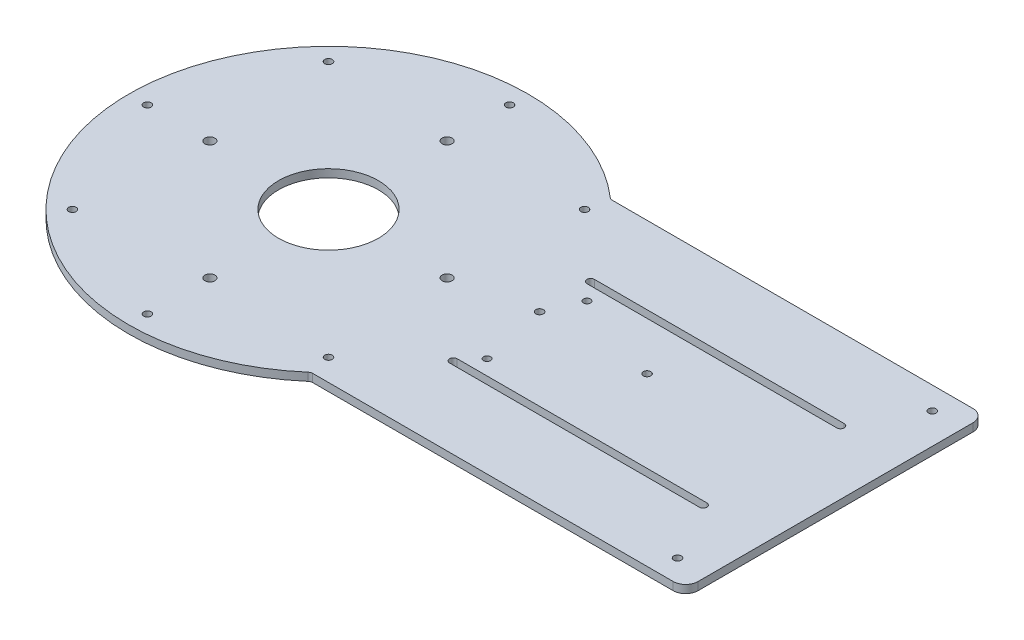
ISO-10303-21;
HEADER;
FILE_DESCRIPTION(('STEP AP214'),'2;1');
FILE_NAME('part.step','',(''),(''),'','','');
FILE_SCHEMA(('AUTOMOTIVE_DESIGN { 1 0 10303 214 1 1 1 1 }'));
ENDSEC;
DATA;
#1=APPLICATION_CONTEXT('core data for automotive mechanical design processes');
#2=APPLICATION_PROTOCOL_DEFINITION('international standard','automotive_design',2000,#1);
#3=PRODUCT_CONTEXT('',#1,'mechanical');
#4=PRODUCT('Part','Part','',(#3));
#5=PRODUCT_RELATED_PRODUCT_CATEGORY('part','',(#4));
#6=PRODUCT_DEFINITION_FORMATION('','',#4);
#7=PRODUCT_DEFINITION_CONTEXT('part definition',#1,'design');
#8=PRODUCT_DEFINITION('design','',#6,#7);
#9=PRODUCT_DEFINITION_SHAPE('','',#8);
#10=(LENGTH_UNIT() NAMED_UNIT(*) SI_UNIT(.MILLI.,.METRE.));
#11=(NAMED_UNIT(*) PLANE_ANGLE_UNIT() SI_UNIT($,.RADIAN.));
#12=(NAMED_UNIT(*) SI_UNIT($,.STERADIAN.) SOLID_ANGLE_UNIT());
#13=UNCERTAINTY_MEASURE_WITH_UNIT(LENGTH_MEASURE(1.E-05),#10,'distance_accuracy_value','');
#14=(GEOMETRIC_REPRESENTATION_CONTEXT(3) GLOBAL_UNCERTAINTY_ASSIGNED_CONTEXT((#13)) GLOBAL_UNIT_ASSIGNED_CONTEXT((#10,
#11,#12)) REPRESENTATION_CONTEXT('',''));
#15=CARTESIAN_POINT('',(0.,0.,0.));
#16=DIRECTION('',(0.,0.,1.));
#17=DIRECTION('',(1.,0.,0.));
#18=AXIS2_PLACEMENT_3D('',#15,#16,#17);
#19=CARTESIAN_POINT('',(157.5,3.2,-27.5));
#20=DIRECTION('',(0.,-1.,0.));
#21=DIRECTION('',(0.,0.,-1.));
#22=AXIS2_PLACEMENT_3D('',#19,#20,#21);
#23=CYLINDRICAL_SURFACE('',#22,1.5);
#24=CARTESIAN_POINT('',(157.5,0.,-27.5));
#25=DIRECTION('',(0.,1.,0.));
#26=DIRECTION('',(0.,0.,1.));
#27=AXIS2_PLACEMENT_3D('',#24,#25,#26);
#28=CIRCLE('',#27,1.5);
#29=CARTESIAN_POINT('',(157.5,0.,-29.));
#30=VERTEX_POINT('',#29);
#31=CARTESIAN_POINT('',(157.5,0.,-26.));
#32=VERTEX_POINT('',#31);
#33=EDGE_CURVE('E317',#30,#32,#28,.T.);
#34=ORIENTED_EDGE('',*,*,#33,.F.);
#35=DIRECTION('',(0.,-1.,0.));
#36=VECTOR('',#35,1.);
#37=CARTESIAN_POINT('',(157.5,3.2,-29.));
#38=LINE('',#37,#36);
#39=CARTESIAN_POINT('',(157.5,3.2,-29.));
#40=VERTEX_POINT('',#39);
#41=EDGE_CURVE('E11',#40,#30,#38,.T.);
#42=ORIENTED_EDGE('',*,*,#41,.F.);
#43=CARTESIAN_POINT('',(157.5,3.2,-27.5));
#44=DIRECTION('',(0.,1.,0.));
#45=DIRECTION('',(0.,0.,1.));
#46=AXIS2_PLACEMENT_3D('',#43,#44,#45);
#47=CIRCLE('',#46,1.5);
#48=CARTESIAN_POINT('',(157.5,3.2,-26.));
#49=VERTEX_POINT('',#48);
#50=EDGE_CURVE('E186',#40,#49,#47,.T.);
#51=ORIENTED_EDGE('',*,*,#50,.T.);
#52=DIRECTION('',(0.,-1.,0.));
#53=VECTOR('',#52,1.);
#54=CARTESIAN_POINT('',(157.5,3.2,-26.));
#55=LINE('',#54,#53);
#56=EDGE_CURVE('E125',#49,#32,#55,.T.);
#57=ORIENTED_EDGE('',*,*,#56,.T.);
#58=EDGE_LOOP('',(#34,#42,#51,#57));
#59=FACE_BOUND('',#58,.T.);
#60=ADVANCED_FACE('F47',(#59),#23,.F.);
#61=CARTESIAN_POINT('',(0.,3.2,-28.9999999999999));
#62=DIRECTION('',(0.,0.,1.));
#63=DIRECTION('',(1.,0.,0.));
#64=AXIS2_PLACEMENT_3D('',#61,#62,#63);
#65=PLANE('',#64);
#66=DIRECTION('',(-1.,0.,0.));
#67=VECTOR('',#66,1.);
#68=CARTESIAN_POINT('',(0.,0.,-28.9999999999999));
#69=LINE('',#68,#67);
#70=CARTESIAN_POINT('',(257.5,0.,-29.));
#71=VERTEX_POINT('',#70);
#72=EDGE_CURVE('E176',#71,#30,#69,.T.);
#73=ORIENTED_EDGE('',*,*,#72,.F.);
#74=DIRECTION('',(0.,-1.,0.));
#75=VECTOR('',#74,1.);
#76=CARTESIAN_POINT('',(257.5,3.2,-29.));
#77=LINE('',#76,#75);
#78=CARTESIAN_POINT('',(257.5,3.2,-29.));
#79=VERTEX_POINT('',#78);
#80=EDGE_CURVE('E58',#79,#71,#77,.T.);
#81=ORIENTED_EDGE('',*,*,#80,.F.);
#82=DIRECTION('',(-1.,0.,0.));
#83=VECTOR('',#82,1.);
#84=CARTESIAN_POINT('',(0.,3.2,-28.9999999999999));
#85=LINE('',#84,#83);
#86=EDGE_CURVE('E174',#79,#40,#85,.T.);
#87=ORIENTED_EDGE('',*,*,#86,.T.);
#88=ORIENTED_EDGE('',*,*,#41,.T.);
#89=EDGE_LOOP('',(#73,#81,#87,#88));
#90=FACE_BOUND('',#89,.T.);
#91=ADVANCED_FACE('F173',(#90),#65,.T.);
#92=CARTESIAN_POINT('',(257.5,3.2,-27.5));
#93=DIRECTION('',(0.,-1.,0.));
#94=DIRECTION('',(0.,0.,-1.));
#95=AXIS2_PLACEMENT_3D('',#92,#93,#94);
#96=CYLINDRICAL_SURFACE('',#95,1.50000000000003);
#97=CARTESIAN_POINT('',(257.5,0.,-27.5));
#98=DIRECTION('',(0.,1.,0.));
#99=DIRECTION('',(0.,0.,1.));
#100=AXIS2_PLACEMENT_3D('',#97,#98,#99);
#101=CIRCLE('',#100,1.50000000000003);
#102=CARTESIAN_POINT('',(257.5,0.,-26.));
#103=VERTEX_POINT('',#102);
#104=EDGE_CURVE('E323',#103,#71,#101,.T.);
#105=ORIENTED_EDGE('',*,*,#104,.F.);
#106=DIRECTION('',(0.,-1.,0.));
#107=VECTOR('',#106,1.);
#108=CARTESIAN_POINT('',(257.5,3.2,-26.));
#109=LINE('',#108,#107);
#110=CARTESIAN_POINT('',(257.5,3.2,-26.));
#111=VERTEX_POINT('',#110);
#112=EDGE_CURVE('E118',#111,#103,#109,.T.);
#113=ORIENTED_EDGE('',*,*,#112,.F.);
#114=CARTESIAN_POINT('',(257.5,3.2,-27.5));
#115=DIRECTION('',(0.,1.,0.));
#116=DIRECTION('',(0.,0.,1.));
#117=AXIS2_PLACEMENT_3D('',#114,#115,#116);
#118=CIRCLE('',#117,1.50000000000003);
#119=EDGE_CURVE('E185',#111,#79,#118,.T.);
#120=ORIENTED_EDGE('',*,*,#119,.T.);
#121=ORIENTED_EDGE('',*,*,#80,.T.);
#122=EDGE_LOOP('',(#105,#113,#120,#121));
#123=FACE_BOUND('',#122,.T.);
#124=ADVANCED_FACE('F189',(#123),#96,.F.);
#125=CARTESIAN_POINT('',(157.5,3.2,27.5));
#126=DIRECTION('',(0.,-1.,0.));
#127=DIRECTION('',(0.,0.,-1.));
#128=AXIS2_PLACEMENT_3D('',#125,#126,#127);
#129=CYLINDRICAL_SURFACE('',#128,1.5);
#130=CARTESIAN_POINT('',(157.5,0.,27.5));
#131=DIRECTION('',(0.,1.,0.));
#132=DIRECTION('',(0.,0.,1.));
#133=AXIS2_PLACEMENT_3D('',#130,#131,#132);
#134=CIRCLE('',#133,1.5);
#135=CARTESIAN_POINT('',(157.5,0.,26.));
#136=VERTEX_POINT('',#135);
#137=CARTESIAN_POINT('',(157.5,0.,29.));
#138=VERTEX_POINT('',#137);
#139=EDGE_CURVE('E301',#136,#138,#134,.T.);
#140=ORIENTED_EDGE('',*,*,#139,.F.);
#141=DIRECTION('',(0.,-1.,0.));
#142=VECTOR('',#141,1.);
#143=CARTESIAN_POINT('',(157.5,3.2,26.));
#144=LINE('',#143,#142);
#145=CARTESIAN_POINT('',(157.5,3.2,26.));
#146=VERTEX_POINT('',#145);
#147=EDGE_CURVE('E340',#146,#136,#144,.T.);
#148=ORIENTED_EDGE('',*,*,#147,.F.);
#149=CARTESIAN_POINT('',(157.5,3.2,27.5));
#150=DIRECTION('',(0.,1.,0.));
#151=DIRECTION('',(0.,0.,1.));
#152=AXIS2_PLACEMENT_3D('',#149,#150,#151);
#153=CIRCLE('',#152,1.5);
#154=CARTESIAN_POINT('',(157.5,3.2,29.));
#155=VERTEX_POINT('',#154);
#156=EDGE_CURVE('E822',#146,#155,#153,.T.);
#157=ORIENTED_EDGE('',*,*,#156,.T.);
#158=DIRECTION('',(0.,-1.,0.));
#159=VECTOR('',#158,1.);
#160=CARTESIAN_POINT('',(157.5,3.2,29.));
#161=LINE('',#160,#159);
#162=EDGE_CURVE('E343',#155,#138,#161,.T.);
#163=ORIENTED_EDGE('',*,*,#162,.T.);
#164=EDGE_LOOP('',(#140,#148,#157,#163));
#165=FACE_BOUND('',#164,.T.);
#166=ADVANCED_FACE('F447',(#165),#129,.F.);
#167=CARTESIAN_POINT('',(0.,3.2,26.0000000000001));
#168=DIRECTION('',(0.,0.,-1.));
#169=DIRECTION('',(-1.,0.,0.));
#170=AXIS2_PLACEMENT_3D('',#167,#168,#169);
#171=PLANE('',#170);
#172=DIRECTION('',(1.,0.,0.));
#173=VECTOR('',#172,1.);
#174=CARTESIAN_POINT('',(0.,0.,26.0000000000001));
#175=LINE('',#174,#173);
#176=CARTESIAN_POINT('',(257.5,0.,26.));
#177=VERTEX_POINT('',#176);
#178=EDGE_CURVE('E305',#136,#177,#175,.T.);
#179=ORIENTED_EDGE('',*,*,#178,.T.);
#180=DIRECTION('',(0.,-1.,0.));
#181=VECTOR('',#180,1.);
#182=CARTESIAN_POINT('',(257.5,3.2,26.));
#183=LINE('',#182,#181);
#184=CARTESIAN_POINT('',(257.5,3.2,26.));
#185=VERTEX_POINT('',#184);
#186=EDGE_CURVE('E349',#185,#177,#183,.T.);
#187=ORIENTED_EDGE('',*,*,#186,.F.);
#188=DIRECTION('',(1.,0.,0.));
#189=VECTOR('',#188,1.);
#190=CARTESIAN_POINT('',(0.,3.2,26.0000000000001));
#191=LINE('',#190,#189);
#192=EDGE_CURVE('E825',#146,#185,#191,.T.);
#193=ORIENTED_EDGE('',*,*,#192,.F.);
#194=ORIENTED_EDGE('',*,*,#147,.T.);
#195=EDGE_LOOP('',(#179,#187,#193,#194));
#196=FACE_BOUND('',#195,.T.);
#197=ADVANCED_FACE('F443',(#196),#171,.F.);
#198=CARTESIAN_POINT('',(257.5,3.2,27.5));
#199=DIRECTION('',(0.,-1.,0.));
#200=DIRECTION('',(0.,0.,-1.));
#201=AXIS2_PLACEMENT_3D('',#198,#199,#200);
#202=CYLINDRICAL_SURFACE('',#201,1.50000000000003);
#203=CARTESIAN_POINT('',(257.5,0.,27.5));
#204=DIRECTION('',(0.,1.,0.));
#205=DIRECTION('',(0.,0.,1.));
#206=AXIS2_PLACEMENT_3D('',#203,#204,#205);
#207=CIRCLE('',#206,1.50000000000003);
#208=CARTESIAN_POINT('',(257.5,0.,29.));
#209=VERTEX_POINT('',#208);
#210=EDGE_CURVE('E309',#209,#177,#207,.T.);
#211=ORIENTED_EDGE('',*,*,#210,.F.);
#212=DIRECTION('',(0.,-1.,0.));
#213=VECTOR('',#212,1.);
#214=CARTESIAN_POINT('',(257.5,3.2,29.));
#215=LINE('',#214,#213);
#216=CARTESIAN_POINT('',(257.5,3.2,29.));
#217=VERTEX_POINT('',#216);
#218=EDGE_CURVE('E346',#217,#209,#215,.T.);
#219=ORIENTED_EDGE('',*,*,#218,.F.);
#220=CARTESIAN_POINT('',(257.5,3.2,27.5));
#221=DIRECTION('',(0.,1.,0.));
#222=DIRECTION('',(0.,0.,1.));
#223=AXIS2_PLACEMENT_3D('',#220,#221,#222);
#224=CIRCLE('',#223,1.50000000000003);
#225=EDGE_CURVE('E833',#217,#185,#224,.T.);
#226=ORIENTED_EDGE('',*,*,#225,.T.);
#227=ORIENTED_EDGE('',*,*,#186,.T.);
#228=EDGE_LOOP('',(#211,#219,#226,#227));
#229=FACE_BOUND('',#228,.T.);
#230=ADVANCED_FACE('F440',(#229),#202,.F.);
#231=CARTESIAN_POINT('',(283.,3.2,0.));
#232=DIRECTION('',(1.,0.,0.));
#233=DIRECTION('',(0.,0.,-1.));
#234=AXIS2_PLACEMENT_3D('',#231,#232,#233);
#235=PLANE('',#234);
#236=DIRECTION('',(0.,0.,1.));
#237=VECTOR('',#236,1.);
#238=CARTESIAN_POINT('',(283.,0.,0.));
#239=LINE('',#238,#237);
#240=CARTESIAN_POINT('',(283.,0.,-55.));
#241=VERTEX_POINT('',#240);
#242=CARTESIAN_POINT('',(283.,0.,55.));
#243=VERTEX_POINT('',#242);
#244=EDGE_CURVE('E213',#241,#243,#239,.T.);
#245=ORIENTED_EDGE('',*,*,#244,.F.);
#246=DIRECTION('',(0.,-1.,0.));
#247=VECTOR('',#246,1.);
#248=CARTESIAN_POINT('',(283.,3.2,-55.));
#249=LINE('',#248,#247);
#250=CARTESIAN_POINT('',(283.,3.2,-55.));
#251=VERTEX_POINT('',#250);
#252=EDGE_CURVE('E51',#251,#241,#249,.T.);
#253=ORIENTED_EDGE('',*,*,#252,.F.);
#254=DIRECTION('',(0.,0.,1.));
#255=VECTOR('',#254,1.);
#256=CARTESIAN_POINT('',(283.,3.2,0.));
#257=LINE('',#256,#255);
#258=CARTESIAN_POINT('',(283.,3.2,55.));
#259=VERTEX_POINT('',#258);
#260=EDGE_CURVE('E389',#251,#259,#257,.T.);
#261=ORIENTED_EDGE('',*,*,#260,.T.);
#262=DIRECTION('',(0.,-1.,0.));
#263=VECTOR('',#262,1.);
#264=CARTESIAN_POINT('',(283.,3.2,55.));
#265=LINE('',#264,#263);
#266=EDGE_CURVE('E204',#259,#243,#265,.T.);
#267=ORIENTED_EDGE('',*,*,#266,.T.);
#268=EDGE_LOOP('',(#245,#253,#261,#267));
#269=FACE_BOUND('',#268,.T.);
#270=ADVANCED_FACE('F388',(#269),#235,.T.);
#271=CARTESIAN_POINT('',(278.,3.2,-55.));
#272=DIRECTION('',(0.,-1.,0.));
#273=DIRECTION('',(0.,0.,-1.));
#274=AXIS2_PLACEMENT_3D('',#271,#272,#273);
#275=CYLINDRICAL_SURFACE('',#274,5.);
#276=CARTESIAN_POINT('',(278.,0.,-55.));
#277=DIRECTION('',(0.,1.,0.));
#278=DIRECTION('',(0.,0.,1.));
#279=AXIS2_PLACEMENT_3D('',#276,#277,#278);
#280=CIRCLE('',#279,5.);
#281=CARTESIAN_POINT('',(278.,0.,-60.));
#282=VERTEX_POINT('',#281);
#283=EDGE_CURVE('E217',#241,#282,#280,.T.);
#284=ORIENTED_EDGE('',*,*,#283,.T.);
#285=DIRECTION('',(0.,-1.,0.));
#286=VECTOR('',#285,1.);
#287=CARTESIAN_POINT('',(278.,3.2,-60.));
#288=LINE('',#287,#286);
#289=CARTESIAN_POINT('',(278.,3.2,-60.));
#290=VERTEX_POINT('',#289);
#291=EDGE_CURVE('E372',#290,#282,#288,.T.);
#292=ORIENTED_EDGE('',*,*,#291,.F.);
#293=CARTESIAN_POINT('',(278.,3.2,-55.));
#294=DIRECTION('',(0.,1.,0.));
#295=DIRECTION('',(0.,0.,1.));
#296=AXIS2_PLACEMENT_3D('',#293,#294,#295);
#297=CIRCLE('',#296,5.);
#298=EDGE_CURVE('E382',#251,#290,#297,.T.);
#299=ORIENTED_EDGE('',*,*,#298,.F.);
#300=ORIENTED_EDGE('',*,*,#252,.T.);
#301=EDGE_LOOP('',(#284,#292,#299,#300));
#302=FACE_BOUND('',#301,.T.);
#303=ADVANCED_FACE('F380',(#302),#275,.T.);
#304=CARTESIAN_POINT('',(0.,3.2,-60.));
#305=DIRECTION('',(0.,0.,1.));
#306=DIRECTION('',(1.,0.,0.));
#307=AXIS2_PLACEMENT_3D('',#304,#305,#306);
#308=PLANE('',#307);
#309=DIRECTION('',(-1.,0.,0.));
#310=VECTOR('',#309,1.);
#311=CARTESIAN_POINT('',(0.,0.,-60.));
#312=LINE('',#311,#310);
#313=CARTESIAN_POINT('',(133.665631459995,0.,-60.));
#314=VERTEX_POINT('',#313);
#315=EDGE_CURVE('E221',#282,#314,#312,.T.);
#316=ORIENTED_EDGE('',*,*,#315,.T.);
#317=DIRECTION('',(0.,-1.,0.));
#318=VECTOR('',#317,1.);
#319=CARTESIAN_POINT('',(133.665631459995,3.2,-60.));
#320=LINE('',#319,#318);
#321=CARTESIAN_POINT('',(133.665631459995,3.2,-60.));
#322=VERTEX_POINT('',#321);
#323=EDGE_CURVE('E369',#322,#314,#320,.T.);
#324=ORIENTED_EDGE('',*,*,#323,.F.);
#325=DIRECTION('',(-1.,0.,0.));
#326=VECTOR('',#325,1.);
#327=CARTESIAN_POINT('',(0.,3.2,-60.));
#328=LINE('',#327,#326);
#329=EDGE_CURVE('E892',#290,#322,#328,.T.);
#330=ORIENTED_EDGE('',*,*,#329,.F.);
#331=ORIENTED_EDGE('',*,*,#291,.T.);
#332=EDGE_LOOP('',(#316,#324,#330,#331));
#333=FACE_BOUND('',#332,.T.);
#334=ADVANCED_FACE('F417',(#333),#308,.F.);
#335=CARTESIAN_POINT('',(133.665631459995,3.2,-62.));
#336=DIRECTION('',(0.,-1.,0.));
#337=DIRECTION('',(0.,0.,-1.));
#338=AXIS2_PLACEMENT_3D('',#335,#336,#337);
#339=CYLINDRICAL_SURFACE('',#338,1.99999999999999);
#340=CARTESIAN_POINT('',(133.665631459995,0.,-62.));
#341=DIRECTION('',(0.,1.,0.));
#342=DIRECTION('',(0.,0.,1.));
#343=AXIS2_PLACEMENT_3D('',#340,#341,#342);
#344=CIRCLE('',#343,1.99999999999999);
#345=CARTESIAN_POINT('',(132.356713619507,0.,-60.4878048780488));
#346=VERTEX_POINT('',#345);
#347=EDGE_CURVE('E225',#314,#346,#344,.F.);
#348=ORIENTED_EDGE('',*,*,#347,.T.);
#349=DIRECTION('',(0.,-1.,0.));
#350=VECTOR('',#349,1.);
#351=CARTESIAN_POINT('',(132.356713619507,3.2,-60.4878048780488));
#352=LINE('',#351,#350);
#353=CARTESIAN_POINT('',(132.356713619507,3.2,-60.4878048780488));
#354=VERTEX_POINT('',#353);
#355=EDGE_CURVE('E365',#354,#346,#352,.T.);
#356=ORIENTED_EDGE('',*,*,#355,.F.);
#357=CARTESIAN_POINT('',(133.665631459995,3.2,-62.));
#358=DIRECTION('',(0.,1.,0.));
#359=DIRECTION('',(0.,0.,1.));
#360=AXIS2_PLACEMENT_3D('',#357,#358,#359);
#361=CIRCLE('',#360,1.99999999999999);
#362=EDGE_CURVE('E415',#322,#354,#361,.F.);
#363=ORIENTED_EDGE('',*,*,#362,.F.);
#364=ORIENTED_EDGE('',*,*,#323,.T.);
#365=EDGE_LOOP('',(#348,#356,#363,#364));
#366=FACE_BOUND('',#365,.T.);
#367=ADVANCED_FACE('F413',(#366),#339,.F.);
#368=CARTESIAN_POINT('',(80.,3.2,0.));
#369=DIRECTION('',(0.,-1.,0.));
#370=DIRECTION('',(0.,0.,-1.));
#371=AXIS2_PLACEMENT_3D('',#368,#369,#370);
#372=CYLINDRICAL_SURFACE('',#371,80.);
#373=CARTESIAN_POINT('',(80.,0.,0.));
#374=DIRECTION('',(0.,1.,0.));
#375=DIRECTION('',(0.,0.,1.));
#376=AXIS2_PLACEMENT_3D('',#373,#374,#375);
#377=CIRCLE('',#376,80.);
#378=CARTESIAN_POINT('',(132.356713619507,0.,60.4878048780488));
#379=VERTEX_POINT('',#378);
#380=EDGE_CURVE('E229',#346,#379,#377,.T.);
#381=ORIENTED_EDGE('',*,*,#380,.T.);
#382=DIRECTION('',(0.,-1.,0.));
#383=VECTOR('',#382,1.);
#384=CARTESIAN_POINT('',(132.356713619507,3.2,60.4878048780488));
#385=LINE('',#384,#383);
#386=CARTESIAN_POINT('',(132.356713619507,3.2,60.4878048780488));
#387=VERTEX_POINT('',#386);
#388=EDGE_CURVE('E362',#387,#379,#385,.T.);
#389=ORIENTED_EDGE('',*,*,#388,.F.);
#390=CARTESIAN_POINT('',(80.,3.2,0.));
#391=DIRECTION('',(0.,1.,0.));
#392=DIRECTION('',(0.,0.,1.));
#393=AXIS2_PLACEMENT_3D('',#390,#391,#392);
#394=CIRCLE('',#393,80.);
#395=EDGE_CURVE('E887',#354,#387,#394,.T.);
#396=ORIENTED_EDGE('',*,*,#395,.F.);
#397=ORIENTED_EDGE('',*,*,#355,.T.);
#398=EDGE_LOOP('',(#381,#389,#396,#397));
#399=FACE_BOUND('',#398,.T.);
#400=ADVANCED_FACE('F409',(#399),#372,.T.);
#401=CARTESIAN_POINT('',(133.665631459995,3.2,62.));
#402=DIRECTION('',(0.,-1.,0.));
#403=DIRECTION('',(0.,0.,-1.));
#404=AXIS2_PLACEMENT_3D('',#401,#402,#403);
#405=CYLINDRICAL_SURFACE('',#404,2.);
#406=CARTESIAN_POINT('',(133.665631459995,0.,62.));
#407=DIRECTION('',(0.,1.,0.));
#408=DIRECTION('',(0.,0.,1.));
#409=AXIS2_PLACEMENT_3D('',#406,#407,#408);
#410=CIRCLE('',#409,2.);
#411=CARTESIAN_POINT('',(133.665631459995,0.,60.));
#412=VERTEX_POINT('',#411);
#413=EDGE_CURVE('E233',#412,#379,#410,.T.);
#414=ORIENTED_EDGE('',*,*,#413,.F.);
#415=DIRECTION('',(0.,-1.,0.));
#416=VECTOR('',#415,1.);
#417=CARTESIAN_POINT('',(133.665631459995,3.2,60.));
#418=LINE('',#417,#416);
#419=CARTESIAN_POINT('',(133.665631459995,3.2,60.));
#420=VERTEX_POINT('',#419);
#421=EDGE_CURVE('E359',#420,#412,#418,.T.);
#422=ORIENTED_EDGE('',*,*,#421,.F.);
#423=CARTESIAN_POINT('',(133.665631459995,3.2,62.));
#424=DIRECTION('',(0.,1.,0.));
#425=DIRECTION('',(0.,0.,1.));
#426=AXIS2_PLACEMENT_3D('',#423,#424,#425);
#427=CIRCLE('',#426,2.);
#428=EDGE_CURVE('E407',#420,#387,#427,.T.);
#429=ORIENTED_EDGE('',*,*,#428,.T.);
#430=ORIENTED_EDGE('',*,*,#388,.T.);
#431=EDGE_LOOP('',(#414,#422,#429,#430));
#432=FACE_BOUND('',#431,.T.);
#433=ADVANCED_FACE('F405',(#432),#405,.F.);
#434=CARTESIAN_POINT('',(0.,3.2,60.));
#435=DIRECTION('',(0.,0.,1.));
#436=DIRECTION('',(1.,0.,0.));
#437=AXIS2_PLACEMENT_3D('',#434,#435,#436);
#438=PLANE('',#437);
#439=DIRECTION('',(-1.,0.,0.));
#440=VECTOR('',#439,1.);
#441=CARTESIAN_POINT('',(0.,0.,60.));
#442=LINE('',#441,#440);
#443=CARTESIAN_POINT('',(278.,0.,60.));
#444=VERTEX_POINT('',#443);
#445=EDGE_CURVE('E237',#444,#412,#442,.T.);
#446=ORIENTED_EDGE('',*,*,#445,.F.);
#447=DIRECTION('',(0.,-1.,0.));
#448=VECTOR('',#447,1.);
#449=CARTESIAN_POINT('',(278.,3.2,60.));
#450=LINE('',#449,#448);
#451=CARTESIAN_POINT('',(278.,3.2,60.));
#452=VERTEX_POINT('',#451);
#453=EDGE_CURVE('E356',#452,#444,#450,.T.);
#454=ORIENTED_EDGE('',*,*,#453,.F.);
#455=DIRECTION('',(-1.,0.,0.));
#456=VECTOR('',#455,1.);
#457=CARTESIAN_POINT('',(0.,3.2,60.));
#458=LINE('',#457,#456);
#459=EDGE_CURVE('E401',#452,#420,#458,.T.);
#460=ORIENTED_EDGE('',*,*,#459,.T.);
#461=ORIENTED_EDGE('',*,*,#421,.T.);
#462=EDGE_LOOP('',(#446,#454,#460,#461));
#463=FACE_BOUND('',#462,.T.);
#464=ADVANCED_FACE('F398',(#463),#438,.T.);
#465=CARTESIAN_POINT('',(163.5,3.2,-20.));
#466=DIRECTION('',(0.,-1.,0.));
#467=DIRECTION('',(0.,0.,-1.));
#468=AXIS2_PLACEMENT_3D('',#465,#466,#467);
#469=CYLINDRICAL_SURFACE('',#468,1.4);
#470=CARTESIAN_POINT('',(163.5,3.2,-20.));
#471=DIRECTION('',(0.,1.,0.));
#472=DIRECTION('',(0.,0.,1.));
#473=AXIS2_PLACEMENT_3D('',#470,#471,#472);
#474=CIRCLE('',#473,1.4);
#475=CARTESIAN_POINT('',(163.5,3.2,-18.6));
#476=VERTEX_POINT('',#475);
#477=EDGE_CURVE('E193',#476,#476,#474,.T.);
#478=ORIENTED_EDGE('',*,*,#477,.T.);
#479=EDGE_LOOP('',(#478));
#480=FACE_BOUND('',#479,.T.);
#481=CARTESIAN_POINT('',(163.5,0.,-20.));
#482=DIRECTION('',(0.,1.,0.));
#483=DIRECTION('',(0.,0.,1.));
#484=AXIS2_PLACEMENT_3D('',#481,#482,#483);
#485=CIRCLE('',#484,1.4);
#486=CARTESIAN_POINT('',(163.5,0.,-18.6));
#487=VERTEX_POINT('',#486);
#488=EDGE_CURVE('E329',#487,#487,#485,.T.);
#489=ORIENTED_EDGE('',*,*,#488,.F.);
#490=EDGE_LOOP('',(#489));
#491=FACE_BOUND('',#490,.T.);
#492=ADVANCED_FACE('F512',(#480,#491),#469,.F.);
#493=CARTESIAN_POINT('',(0.,3.2,-26.));
#494=DIRECTION('',(0.,0.,1.));
#495=DIRECTION('',(1.,0.,0.));
#496=AXIS2_PLACEMENT_3D('',#493,#494,#495);
#497=PLANE('',#496);
#498=DIRECTION('',(-1.,0.,0.));
#499=VECTOR('',#498,1.);
#500=CARTESIAN_POINT('',(0.,0.,-26.));
#501=LINE('',#500,#499);
#502=EDGE_CURVE('E326',#103,#32,#501,.T.);
#503=ORIENTED_EDGE('',*,*,#502,.T.);
#504=ORIENTED_EDGE('',*,*,#56,.F.);
#505=DIRECTION('',(-1.,0.,0.));
#506=VECTOR('',#505,1.);
#507=CARTESIAN_POINT('',(0.,3.2,-26.));
#508=LINE('',#507,#506);
#509=EDGE_CURVE('E67',#111,#49,#508,.T.);
#510=ORIENTED_EDGE('',*,*,#509,.F.);
#511=ORIENTED_EDGE('',*,*,#112,.T.);
#512=EDGE_LOOP('',(#503,#504,#510,#511));
#513=FACE_BOUND('',#512,.T.);
#514=ADVANCED_FACE('F438',(#513),#497,.F.);
#515=CARTESIAN_POINT('',(0.,3.2,29.));
#516=DIRECTION('',(0.,0.,-1.));
#517=DIRECTION('',(-1.,0.,0.));
#518=AXIS2_PLACEMENT_3D('',#515,#516,#517);
#519=PLANE('',#518);
#520=DIRECTION('',(1.,0.,0.));
#521=VECTOR('',#520,1.);
#522=CARTESIAN_POINT('',(0.,0.,29.));
#523=LINE('',#522,#521);
#524=EDGE_CURVE('E313',#138,#209,#523,.T.);
#525=ORIENTED_EDGE('',*,*,#524,.F.);
#526=ORIENTED_EDGE('',*,*,#162,.F.);
#527=DIRECTION('',(1.,0.,0.));
#528=VECTOR('',#527,1.);
#529=CARTESIAN_POINT('',(0.,3.2,29.));
#530=LINE('',#529,#528);
#531=EDGE_CURVE('E828',#155,#217,#530,.T.);
#532=ORIENTED_EDGE('',*,*,#531,.T.);
#533=ORIENTED_EDGE('',*,*,#218,.T.);
#534=EDGE_LOOP('',(#525,#526,#532,#533));
#535=FACE_BOUND('',#534,.T.);
#536=ADVANCED_FACE('F434',(#535),#519,.T.);
#537=CARTESIAN_POINT('',(270.75,3.2,51.));
#538=DIRECTION('',(0.,-1.,0.));
#539=DIRECTION('',(0.,0.,-1.));
#540=AXIS2_PLACEMENT_3D('',#537,#538,#539);
#541=CYLINDRICAL_SURFACE('',#540,1.50000000000002);
#542=CARTESIAN_POINT('',(270.75,3.2,51.));
#543=DIRECTION('',(0.,1.,0.));
#544=DIRECTION('',(0.,0.,1.));
#545=AXIS2_PLACEMENT_3D('',#542,#543,#544);
#546=CIRCLE('',#545,1.50000000000002);
#547=CARTESIAN_POINT('',(270.75,3.2,52.5));
#548=VERTEX_POINT('',#547);
#549=EDGE_CURVE('E818',#548,#548,#546,.F.);
#550=ORIENTED_EDGE('',*,*,#549,.F.);
#551=EDGE_LOOP('',(#550));
#552=FACE_BOUND('',#551,.T.);
#553=CARTESIAN_POINT('',(270.75,0.,51.));
#554=DIRECTION('',(0.,1.,0.));
#555=DIRECTION('',(0.,0.,1.));
#556=AXIS2_PLACEMENT_3D('',#553,#554,#555);
#557=CIRCLE('',#556,1.50000000000002);
#558=CARTESIAN_POINT('',(270.75,0.,52.5));
#559=VERTEX_POINT('',#558);
#560=EDGE_CURVE('E297',#559,#559,#557,.F.);
#561=ORIENTED_EDGE('',*,*,#560,.T.);
#562=EDGE_LOOP('',(#561));
#563=FACE_BOUND('',#562,.T.);
#564=ADVANCED_FACE('F437',(#552,#563),#541,.F.);
#565=CARTESIAN_POINT('',(270.75,3.2,-51.));
#566=DIRECTION('',(0.,-1.,0.));
#567=DIRECTION('',(0.,0.,-1.));
#568=AXIS2_PLACEMENT_3D('',#565,#566,#567);
#569=CYLINDRICAL_SURFACE('',#568,1.50000000000002);
#570=CARTESIAN_POINT('',(270.75,3.2,-51.));
#571=DIRECTION('',(0.,1.,0.));
#572=DIRECTION('',(0.,0.,1.));
#573=AXIS2_PLACEMENT_3D('',#570,#571,#572);
#574=CIRCLE('',#573,1.50000000000002);
#575=CARTESIAN_POINT('',(270.75,3.2,-49.5));
#576=VERTEX_POINT('',#575);
#577=EDGE_CURVE('E814',#576,#576,#574,.T.);
#578=ORIENTED_EDGE('',*,*,#577,.T.);
#579=EDGE_LOOP('',(#578));
#580=FACE_BOUND('',#579,.T.);
#581=CARTESIAN_POINT('',(270.75,0.,-51.));
#582=DIRECTION('',(0.,1.,0.));
#583=DIRECTION('',(0.,0.,1.));
#584=AXIS2_PLACEMENT_3D('',#581,#582,#583);
#585=CIRCLE('',#584,1.50000000000002);
#586=CARTESIAN_POINT('',(270.75,0.,-49.5));
#587=VERTEX_POINT('',#586);
#588=EDGE_CURVE('E293',#587,#587,#585,.T.);
#589=ORIENTED_EDGE('',*,*,#588,.F.);
#590=EDGE_LOOP('',(#589));
#591=FACE_BOUND('',#590,.T.);
#592=ADVANCED_FACE('F454',(#580,#591),#569,.F.);
#593=CARTESIAN_POINT('',(79.9999999999995,3.2,47.5));
#594=DIRECTION('',(0.,-1.,0.));
#595=DIRECTION('',(0.,0.,-1.));
#596=AXIS2_PLACEMENT_3D('',#593,#594,#595);
#597=CYLINDRICAL_SURFACE('',#596,2.00000000000001);
#598=CARTESIAN_POINT('',(79.9999999999995,3.2,47.5));
#599=DIRECTION('',(0.,1.,0.));
#600=DIRECTION('',(0.,0.,1.));
#601=AXIS2_PLACEMENT_3D('',#598,#599,#600);
#602=CIRCLE('',#601,2.00000000000001);
#603=CARTESIAN_POINT('',(79.9999999999995,3.2,49.5));
#604=VERTEX_POINT('',#603);
#605=EDGE_CURVE('E810',#604,#604,#602,.T.);
#606=ORIENTED_EDGE('',*,*,#605,.T.);
#607=EDGE_LOOP('',(#606));
#608=FACE_BOUND('',#607,.T.);
#609=CARTESIAN_POINT('',(79.9999999999995,0.,47.5));
#610=DIRECTION('',(0.,1.,0.));
#611=DIRECTION('',(0.,0.,1.));
#612=AXIS2_PLACEMENT_3D('',#609,#610,#611);
#613=CIRCLE('',#612,2.00000000000001);
#614=CARTESIAN_POINT('',(79.9999999999995,0.,49.5));
#615=VERTEX_POINT('',#614);
#616=EDGE_CURVE('E289',#615,#615,#613,.T.);
#617=ORIENTED_EDGE('',*,*,#616,.F.);
#618=EDGE_LOOP('',(#617));
#619=FACE_BOUND('',#618,.T.);
#620=ADVANCED_FACE('F458',(#608,#619),#597,.F.);
#621=CARTESIAN_POINT('',(127.5,3.2,3.31690727190098E-13));
#622=DIRECTION('',(0.,-1.,0.));
#623=DIRECTION('',(0.,0.,-1.));
#624=AXIS2_PLACEMENT_3D('',#621,#622,#623);
#625=CYLINDRICAL_SURFACE('',#624,1.99999999999999);
#626=CARTESIAN_POINT('',(127.5,3.2,3.31690727190098E-13));
#627=DIRECTION('',(0.,1.,0.));
#628=DIRECTION('',(0.,0.,1.));
#629=AXIS2_PLACEMENT_3D('',#626,#627,#628);
#630=CIRCLE('',#629,1.99999999999999);
#631=CARTESIAN_POINT('',(127.5,3.2,2.00000000000032));
#632=VERTEX_POINT('',#631);
#633=EDGE_CURVE('E806',#632,#632,#630,.T.);
#634=ORIENTED_EDGE('',*,*,#633,.T.);
#635=EDGE_LOOP('',(#634));
#636=FACE_BOUND('',#635,.T.);
#637=CARTESIAN_POINT('',(127.5,0.,3.31690727190098E-13));
#638=DIRECTION('',(0.,1.,0.));
#639=DIRECTION('',(0.,0.,1.));
#640=AXIS2_PLACEMENT_3D('',#637,#638,#639);
#641=CIRCLE('',#640,1.99999999999999);
#642=CARTESIAN_POINT('',(127.5,0.,2.00000000000032));
#643=VERTEX_POINT('',#642);
#644=EDGE_CURVE('E285',#643,#643,#641,.T.);
#645=ORIENTED_EDGE('',*,*,#644,.F.);
#646=EDGE_LOOP('',(#645));
#647=FACE_BOUND('',#646,.T.);
#648=ADVANCED_FACE('F462',(#636,#647),#625,.F.);
#649=CARTESIAN_POINT('',(80.0000000000002,3.2,-47.5));
#650=DIRECTION('',(0.,-1.,0.));
#651=DIRECTION('',(0.,0.,-1.));
#652=AXIS2_PLACEMENT_3D('',#649,#650,#651);
#653=CYLINDRICAL_SURFACE('',#652,2.);
#654=CARTESIAN_POINT('',(80.0000000000002,3.2,-47.5));
#655=DIRECTION('',(0.,1.,0.));
#656=DIRECTION('',(0.,0.,1.));
#657=AXIS2_PLACEMENT_3D('',#654,#655,#656);
#658=CIRCLE('',#657,2.);
#659=CARTESIAN_POINT('',(80.0000000000002,3.2,-45.5));
#660=VERTEX_POINT('',#659);
#661=EDGE_CURVE('E802',#660,#660,#658,.T.);
#662=ORIENTED_EDGE('',*,*,#661,.T.);
#663=EDGE_LOOP('',(#662));
#664=FACE_BOUND('',#663,.T.);
#665=CARTESIAN_POINT('',(80.0000000000002,0.,-47.5));
#666=DIRECTION('',(0.,1.,0.));
#667=DIRECTION('',(0.,0.,1.));
#668=AXIS2_PLACEMENT_3D('',#665,#666,#667);
#669=CIRCLE('',#668,2.);
#670=CARTESIAN_POINT('',(80.0000000000002,0.,-45.5));
#671=VERTEX_POINT('',#670);
#672=EDGE_CURVE('E281',#671,#671,#669,.T.);
#673=ORIENTED_EDGE('',*,*,#672,.F.);
#674=EDGE_LOOP('',(#673));
#675=FACE_BOUND('',#674,.T.);
#676=ADVANCED_FACE('F466',(#664,#675),#653,.F.);
#677=CARTESIAN_POINT('',(32.5,3.2,0.));
#678=DIRECTION('',(0.,-1.,0.));
#679=DIRECTION('',(0.,0.,-1.));
#680=AXIS2_PLACEMENT_3D('',#677,#678,#679);
#681=CYLINDRICAL_SURFACE('',#680,2.);
#682=CARTESIAN_POINT('',(32.5,3.2,0.));
#683=DIRECTION('',(0.,1.,0.));
#684=DIRECTION('',(0.,0.,1.));
#685=AXIS2_PLACEMENT_3D('',#682,#683,#684);
#686=CIRCLE('',#685,2.);
#687=CARTESIAN_POINT('',(32.5,3.2,2.));
#688=VERTEX_POINT('',#687);
#689=EDGE_CURVE('E798',#688,#688,#686,.T.);
#690=ORIENTED_EDGE('',*,*,#689,.T.);
#691=EDGE_LOOP('',(#690));
#692=FACE_BOUND('',#691,.T.);
#693=CARTESIAN_POINT('',(32.5,0.,0.));
#694=DIRECTION('',(0.,1.,0.));
#695=DIRECTION('',(0.,0.,1.));
#696=AXIS2_PLACEMENT_3D('',#693,#694,#695);
#697=CIRCLE('',#696,2.);
#698=CARTESIAN_POINT('',(32.5,0.,2.));
#699=VERTEX_POINT('',#698);
#700=EDGE_CURVE('E277',#699,#699,#697,.T.);
#701=ORIENTED_EDGE('',*,*,#700,.F.);
#702=EDGE_LOOP('',(#701));
#703=FACE_BOUND('',#702,.T.);
#704=ADVANCED_FACE('F470',(#692,#703),#681,.F.);
#705=CARTESIAN_POINT('',(28.7347583639753,3.2,51.2652416360238));
#706=DIRECTION('',(0.,-1.,0.));
#707=DIRECTION('',(0.,0.,-1.));
#708=AXIS2_PLACEMENT_3D('',#705,#706,#707);
#709=CYLINDRICAL_SURFACE('',#708,1.5);
#710=CARTESIAN_POINT('',(28.7347583639753,3.2,51.2652416360238));
#711=DIRECTION('',(0.,1.,0.));
#712=DIRECTION('',(0.,0.,1.));
#713=AXIS2_PLACEMENT_3D('',#710,#711,#712);
#714=CIRCLE('',#713,1.5);
#715=CARTESIAN_POINT('',(28.7347583639753,3.2,52.7652416360238));
#716=VERTEX_POINT('',#715);
#717=EDGE_CURVE('E794',#716,#716,#714,.T.);
#718=ORIENTED_EDGE('',*,*,#717,.T.);
#719=EDGE_LOOP('',(#718));
#720=FACE_BOUND('',#719,.T.);
#721=CARTESIAN_POINT('',(28.7347583639753,0.,51.2652416360238));
#722=DIRECTION('',(0.,1.,0.));
#723=DIRECTION('',(0.,0.,1.));
#724=AXIS2_PLACEMENT_3D('',#721,#722,#723);
#725=CIRCLE('',#724,1.5);
#726=CARTESIAN_POINT('',(28.7347583639753,0.,52.7652416360238));
#727=VERTEX_POINT('',#726);
#728=EDGE_CURVE('E273',#727,#727,#725,.T.);
#729=ORIENTED_EDGE('',*,*,#728,.F.);
#730=EDGE_LOOP('',(#729));
#731=FACE_BOUND('',#730,.T.);
#732=ADVANCED_FACE('F474',(#720,#731),#709,.F.);
#733=CARTESIAN_POINT('',(80.0000000000002,3.2,72.499999999999));
#734=DIRECTION('',(0.,-1.,0.));
#735=DIRECTION('',(0.,0.,-1.));
#736=AXIS2_PLACEMENT_3D('',#733,#734,#735);
#737=CYLINDRICAL_SURFACE('',#736,1.50000000000001);
#738=CARTESIAN_POINT('',(80.0000000000002,3.2,72.499999999999));
#739=DIRECTION('',(0.,1.,0.));
#740=DIRECTION('',(0.,0.,1.));
#741=AXIS2_PLACEMENT_3D('',#738,#739,#740);
#742=CIRCLE('',#741,1.50000000000001);
#743=CARTESIAN_POINT('',(80.0000000000002,3.2,73.999999999999));
#744=VERTEX_POINT('',#743);
#745=EDGE_CURVE('E790',#744,#744,#742,.T.);
#746=ORIENTED_EDGE('',*,*,#745,.T.);
#747=EDGE_LOOP('',(#746));
#748=FACE_BOUND('',#747,.T.);
#749=CARTESIAN_POINT('',(80.0000000000002,0.,72.499999999999));
#750=DIRECTION('',(0.,1.,0.));
#751=DIRECTION('',(0.,0.,1.));
#752=AXIS2_PLACEMENT_3D('',#749,#750,#751);
#753=CIRCLE('',#752,1.50000000000001);
#754=CARTESIAN_POINT('',(80.0000000000002,0.,73.999999999999));
#755=VERTEX_POINT('',#754);
#756=EDGE_CURVE('E269',#755,#755,#753,.T.);
#757=ORIENTED_EDGE('',*,*,#756,.F.);
#758=EDGE_LOOP('',(#757));
#759=FACE_BOUND('',#758,.T.);
#760=ADVANCED_FACE('F478',(#748,#759),#737,.F.);
#761=CARTESIAN_POINT('',(131.265241636025,3.2,51.2652416360235));
#762=DIRECTION('',(0.,-1.,0.));
#763=DIRECTION('',(0.,0.,-1.));
#764=AXIS2_PLACEMENT_3D('',#761,#762,#763);
#765=CYLINDRICAL_SURFACE('',#764,1.49999999999999);
#766=CARTESIAN_POINT('',(131.265241636025,3.2,51.2652416360235));
#767=DIRECTION('',(0.,1.,0.));
#768=DIRECTION('',(0.,0.,1.));
#769=AXIS2_PLACEMENT_3D('',#766,#767,#768);
#770=CIRCLE('',#769,1.49999999999999);
#771=CARTESIAN_POINT('',(131.265241636025,3.2,52.7652416360235));
#772=VERTEX_POINT('',#771);
#773=EDGE_CURVE('E786',#772,#772,#770,.T.);
#774=ORIENTED_EDGE('',*,*,#773,.T.);
#775=EDGE_LOOP('',(#774));
#776=FACE_BOUND('',#775,.T.);
#777=CARTESIAN_POINT('',(131.265241636025,0.,51.2652416360235));
#778=DIRECTION('',(0.,1.,0.));
#779=DIRECTION('',(0.,0.,1.));
#780=AXIS2_PLACEMENT_3D('',#777,#778,#779);
#781=CIRCLE('',#780,1.49999999999999);
#782=CARTESIAN_POINT('',(131.265241636025,0.,52.7652416360235));
#783=VERTEX_POINT('',#782);
#784=EDGE_CURVE('E265',#783,#783,#781,.T.);
#785=ORIENTED_EDGE('',*,*,#784,.F.);
#786=EDGE_LOOP('',(#785));
#787=FACE_BOUND('',#786,.T.);
#788=ADVANCED_FACE('F482',(#776,#787),#765,.F.);
#789=CARTESIAN_POINT('',(131.265241636024,3.2,-51.2652416360261));
#790=DIRECTION('',(0.,-1.,0.));
#791=DIRECTION('',(0.,0.,-1.));
#792=AXIS2_PLACEMENT_3D('',#789,#790,#791);
#793=CYLINDRICAL_SURFACE('',#792,1.5);
#794=CARTESIAN_POINT('',(131.265241636024,3.2,-51.2652416360261));
#795=DIRECTION('',(0.,1.,0.));
#796=DIRECTION('',(0.,0.,1.));
#797=AXIS2_PLACEMENT_3D('',#794,#795,#796);
#798=CIRCLE('',#797,1.5);
#799=CARTESIAN_POINT('',(131.265241636024,3.2,-49.7652416360261));
#800=VERTEX_POINT('',#799);
#801=EDGE_CURVE('E782',#800,#800,#798,.T.);
#802=ORIENTED_EDGE('',*,*,#801,.T.);
#803=EDGE_LOOP('',(#802));
#804=FACE_BOUND('',#803,.T.);
#805=CARTESIAN_POINT('',(131.265241636024,0.,-51.2652416360261));
#806=DIRECTION('',(0.,1.,0.));
#807=DIRECTION('',(0.,0.,1.));
#808=AXIS2_PLACEMENT_3D('',#805,#806,#807);
#809=CIRCLE('',#808,1.5);
#810=CARTESIAN_POINT('',(131.265241636024,0.,-49.7652416360261));
#811=VERTEX_POINT('',#810);
#812=EDGE_CURVE('E261',#811,#811,#809,.T.);
#813=ORIENTED_EDGE('',*,*,#812,.F.);
#814=EDGE_LOOP('',(#813));
#815=FACE_BOUND('',#814,.T.);
#816=ADVANCED_FACE('F486',(#804,#815),#793,.F.);
#817=CARTESIAN_POINT('',(79.9999999999993,3.2,-72.500000000001));
#818=DIRECTION('',(0.,-1.,0.));
#819=DIRECTION('',(0.,0.,-1.));
#820=AXIS2_PLACEMENT_3D('',#817,#818,#819);
#821=CYLINDRICAL_SURFACE('',#820,1.5);
#822=CARTESIAN_POINT('',(79.9999999999993,3.2,-72.500000000001));
#823=DIRECTION('',(0.,1.,0.));
#824=DIRECTION('',(0.,0.,1.));
#825=AXIS2_PLACEMENT_3D('',#822,#823,#824);
#826=CIRCLE('',#825,1.5);
#827=CARTESIAN_POINT('',(79.9999999999993,3.2,-71.000000000001));
#828=VERTEX_POINT('',#827);
#829=EDGE_CURVE('E778',#828,#828,#826,.T.);
#830=ORIENTED_EDGE('',*,*,#829,.T.);
#831=EDGE_LOOP('',(#830));
#832=FACE_BOUND('',#831,.T.);
#833=CARTESIAN_POINT('',(79.9999999999993,0.,-72.500000000001));
#834=DIRECTION('',(0.,1.,0.));
#835=DIRECTION('',(0.,0.,1.));
#836=AXIS2_PLACEMENT_3D('',#833,#834,#835);
#837=CIRCLE('',#836,1.5);
#838=CARTESIAN_POINT('',(79.9999999999993,0.,-71.000000000001));
#839=VERTEX_POINT('',#838);
#840=EDGE_CURVE('E257',#839,#839,#837,.T.);
#841=ORIENTED_EDGE('',*,*,#840,.F.);
#842=EDGE_LOOP('',(#841));
#843=FACE_BOUND('',#842,.T.);
#844=ADVANCED_FACE('F490',(#832,#843),#821,.F.);
#845=CARTESIAN_POINT('',(28.7347583639747,3.2,-51.2652416360251));
#846=DIRECTION('',(0.,-1.,0.));
#847=DIRECTION('',(0.,0.,-1.));
#848=AXIS2_PLACEMENT_3D('',#845,#846,#847);
#849=CYLINDRICAL_SURFACE('',#848,1.5);
#850=CARTESIAN_POINT('',(28.7347583639747,3.2,-51.2652416360251));
#851=DIRECTION('',(0.,1.,0.));
#852=DIRECTION('',(0.,0.,1.));
#853=AXIS2_PLACEMENT_3D('',#850,#851,#852);
#854=CIRCLE('',#853,1.5);
#855=CARTESIAN_POINT('',(28.7347583639747,3.2,-49.7652416360251));
#856=VERTEX_POINT('',#855);
#857=EDGE_CURVE('E774',#856,#856,#854,.T.);
#858=ORIENTED_EDGE('',*,*,#857,.T.);
#859=EDGE_LOOP('',(#858));
#860=FACE_BOUND('',#859,.T.);
#861=CARTESIAN_POINT('',(28.7347583639747,0.,-51.2652416360251));
#862=DIRECTION('',(0.,1.,0.));
#863=DIRECTION('',(0.,0.,1.));
#864=AXIS2_PLACEMENT_3D('',#861,#862,#863);
#865=CIRCLE('',#864,1.5);
#866=CARTESIAN_POINT('',(28.7347583639747,0.,-49.7652416360251));
#867=VERTEX_POINT('',#866);
#868=EDGE_CURVE('E253',#867,#867,#865,.T.);
#869=ORIENTED_EDGE('',*,*,#868,.F.);
#870=EDGE_LOOP('',(#869));
#871=FACE_BOUND('',#870,.T.);
#872=ADVANCED_FACE('F494',(#860,#871),#849,.F.);
#873=CARTESIAN_POINT('',(7.49999999999997,3.2,0.));
#874=DIRECTION('',(0.,-1.,0.));
#875=DIRECTION('',(0.,0.,-1.));
#876=AXIS2_PLACEMENT_3D('',#873,#874,#875);
#877=CYLINDRICAL_SURFACE('',#876,1.5);
#878=CARTESIAN_POINT('',(7.49999999999997,3.2,0.));
#879=DIRECTION('',(0.,1.,0.));
#880=DIRECTION('',(0.,0.,1.));
#881=AXIS2_PLACEMENT_3D('',#878,#879,#880);
#882=CIRCLE('',#881,1.5);
#883=CARTESIAN_POINT('',(7.49999999999997,3.2,1.49999999999996));
#884=VERTEX_POINT('',#883);
#885=EDGE_CURVE('E770',#884,#884,#882,.T.);
#886=ORIENTED_EDGE('',*,*,#885,.T.);
#887=EDGE_LOOP('',(#886));
#888=FACE_BOUND('',#887,.T.);
#889=CARTESIAN_POINT('',(7.49999999999997,0.,0.));
#890=DIRECTION('',(0.,1.,0.));
#891=DIRECTION('',(0.,0.,1.));
#892=AXIS2_PLACEMENT_3D('',#889,#890,#891);
#893=CIRCLE('',#892,1.5);
#894=CARTESIAN_POINT('',(7.49999999999997,0.,1.49999999999996));
#895=VERTEX_POINT('',#894);
#896=EDGE_CURVE('E249',#895,#895,#893,.T.);
#897=ORIENTED_EDGE('',*,*,#896,.F.);
#898=EDGE_LOOP('',(#897));
#899=FACE_BOUND('',#898,.T.);
#900=ADVANCED_FACE('F498',(#888,#899),#877,.F.);
#901=CARTESIAN_POINT('',(80.,3.2,0.));
#902=DIRECTION('',(0.,-1.,0.));
#903=DIRECTION('',(0.,0.,-1.));
#904=AXIS2_PLACEMENT_3D('',#901,#902,#903);
#905=CYLINDRICAL_SURFACE('',#904,20.);
#906=CARTESIAN_POINT('',(80.,3.2,0.));
#907=DIRECTION('',(0.,1.,0.));
#908=DIRECTION('',(0.,0.,1.));
#909=AXIS2_PLACEMENT_3D('',#906,#907,#908);
#910=CIRCLE('',#909,20.);
#911=CARTESIAN_POINT('',(80.,3.2,20.));
#912=VERTEX_POINT('',#911);
#913=EDGE_CURVE('E766',#912,#912,#910,.T.);
#914=ORIENTED_EDGE('',*,*,#913,.T.);
#915=EDGE_LOOP('',(#914));
#916=FACE_BOUND('',#915,.T.);
#917=CARTESIAN_POINT('',(80.,0.,0.));
#918=DIRECTION('',(0.,1.,0.));
#919=DIRECTION('',(0.,0.,1.));
#920=AXIS2_PLACEMENT_3D('',#917,#918,#919);
#921=CIRCLE('',#920,20.);
#922=CARTESIAN_POINT('',(80.,0.,20.));
#923=VERTEX_POINT('',#922);
#924=EDGE_CURVE('E245',#923,#923,#921,.T.);
#925=ORIENTED_EDGE('',*,*,#924,.F.);
#926=EDGE_LOOP('',(#925));
#927=FACE_BOUND('',#926,.T.);
#928=ADVANCED_FACE('F502',(#916,#927),#905,.F.);
#929=CARTESIAN_POINT('',(278.,3.2,55.));
#930=DIRECTION('',(0.,-1.,0.));
#931=DIRECTION('',(0.,0.,-1.));
#932=AXIS2_PLACEMENT_3D('',#929,#930,#931);
#933=CYLINDRICAL_SURFACE('',#932,5.);
#934=CARTESIAN_POINT('',(278.,0.,55.));
#935=DIRECTION('',(0.,1.,0.));
#936=DIRECTION('',(0.,0.,1.));
#937=AXIS2_PLACEMENT_3D('',#934,#935,#936);
#938=CIRCLE('',#937,5.);
#939=EDGE_CURVE('E241',#243,#444,#938,.F.);
#940=ORIENTED_EDGE('',*,*,#939,.F.);
#941=ORIENTED_EDGE('',*,*,#266,.F.);
#942=CARTESIAN_POINT('',(278.,3.2,55.));
#943=DIRECTION('',(0.,1.,0.));
#944=DIRECTION('',(0.,0.,1.));
#945=AXIS2_PLACEMENT_3D('',#942,#943,#944);
#946=CIRCLE('',#945,5.);
#947=EDGE_CURVE('E394',#259,#452,#946,.F.);
#948=ORIENTED_EDGE('',*,*,#947,.T.);
#949=ORIENTED_EDGE('',*,*,#453,.T.);
#950=EDGE_LOOP('',(#940,#941,#948,#949));
#951=FACE_BOUND('',#950,.T.);
#952=ADVANCED_FACE('F393',(#951),#933,.T.);
#953=CARTESIAN_POINT('',(157.75,3.2,-6.79999999999998));
#954=DIRECTION('',(0.,-1.,0.));
#955=DIRECTION('',(0.,0.,-1.));
#956=AXIS2_PLACEMENT_3D('',#953,#954,#955);
#957=CYLINDRICAL_SURFACE('',#956,1.5);
#958=CARTESIAN_POINT('',(157.75,3.2,-6.79999999999998));
#959=DIRECTION('',(0.,1.,0.));
#960=DIRECTION('',(0.,0.,1.));
#961=AXIS2_PLACEMENT_3D('',#958,#959,#960);
#962=CIRCLE('',#961,1.5);
#963=CARTESIAN_POINT('',(157.75,3.2,-5.29999999999998));
#964=VERTEX_POINT('',#963);
#965=EDGE_CURVE('E761',#964,#964,#962,.T.);
#966=ORIENTED_EDGE('',*,*,#965,.T.);
#967=EDGE_LOOP('',(#966));
#968=FACE_BOUND('',#967,.T.);
#969=CARTESIAN_POINT('',(157.75,0.,-6.79999999999998));
#970=DIRECTION('',(0.,1.,0.));
#971=DIRECTION('',(0.,0.,1.));
#972=AXIS2_PLACEMENT_3D('',#969,#970,#971);
#973=CIRCLE('',#972,1.5);
#974=CARTESIAN_POINT('',(157.75,0.,-5.29999999999998));
#975=VERTEX_POINT('',#974);
#976=EDGE_CURVE('E209',#975,#975,#973,.T.);
#977=ORIENTED_EDGE('',*,*,#976,.F.);
#978=EDGE_LOOP('',(#977));
#979=FACE_BOUND('',#978,.T.);
#980=ADVANCED_FACE('F509',(#968,#979),#957,.F.);
#981=CARTESIAN_POINT('',(200.75,3.2,-6.79999999999998));
#982=DIRECTION('',(0.,-1.,0.));
#983=DIRECTION('',(0.,0.,-1.));
#984=AXIS2_PLACEMENT_3D('',#981,#982,#983);
#985=CYLINDRICAL_SURFACE('',#984,1.5);
#986=CARTESIAN_POINT('',(200.75,3.2,-6.79999999999998));
#987=DIRECTION('',(0.,1.,0.));
#988=DIRECTION('',(0.,0.,1.));
#989=AXIS2_PLACEMENT_3D('',#986,#987,#988);
#990=CIRCLE('',#989,1.5);
#991=CARTESIAN_POINT('',(200.75,3.2,-5.29999999999999));
#992=VERTEX_POINT('',#991);
#993=EDGE_CURVE('E337',#992,#992,#990,.T.);
#994=ORIENTED_EDGE('',*,*,#993,.T.);
#995=EDGE_LOOP('',(#994));
#996=FACE_BOUND('',#995,.T.);
#997=CARTESIAN_POINT('',(200.75,0.,-6.79999999999998));
#998=DIRECTION('',(0.,1.,0.));
#999=DIRECTION('',(0.,0.,1.));
#1000=AXIS2_PLACEMENT_3D('',#997,#998,#999);
#1001=CIRCLE('',#1000,1.5);
#1002=CARTESIAN_POINT('',(200.75,0.,-5.29999999999999));
#1003=VERTEX_POINT('',#1002);
#1004=EDGE_CURVE('E205',#1003,#1003,#1001,.T.);
#1005=ORIENTED_EDGE('',*,*,#1004,.F.);
#1006=EDGE_LOOP('',(#1005));
#1007=FACE_BOUND('',#1006,.T.);
#1008=ADVANCED_FACE('F49',(#996,#1007),#985,.F.);
#1009=CARTESIAN_POINT('',(163.5,3.2,20.));
#1010=DIRECTION('',(0.,-1.,0.));
#1011=DIRECTION('',(0.,0.,-1.));
#1012=AXIS2_PLACEMENT_3D('',#1009,#1010,#1011);
#1013=CYLINDRICAL_SURFACE('',#1012,1.4);
#1014=CARTESIAN_POINT('',(163.5,3.2,20.));
#1015=DIRECTION('',(0.,1.,0.));
#1016=DIRECTION('',(0.,0.,1.));
#1017=AXIS2_PLACEMENT_3D('',#1014,#1015,#1016);
#1018=CIRCLE('',#1017,1.4);
#1019=CARTESIAN_POINT('',(163.5,3.2,21.4));
#1020=VERTEX_POINT('',#1019);
#1021=EDGE_CURVE('E200',#1020,#1020,#1018,.F.);
#1022=ORIENTED_EDGE('',*,*,#1021,.F.);
#1023=EDGE_LOOP('',(#1022));
#1024=FACE_BOUND('',#1023,.T.);
#1025=CARTESIAN_POINT('',(163.5,0.,20.));
#1026=DIRECTION('',(0.,1.,0.));
#1027=DIRECTION('',(0.,0.,1.));
#1028=AXIS2_PLACEMENT_3D('',#1025,#1026,#1027);
#1029=CIRCLE('',#1028,1.4);
#1030=CARTESIAN_POINT('',(163.5,0.,21.4));
#1031=VERTEX_POINT('',#1030);
#1032=EDGE_CURVE('E333',#1031,#1031,#1029,.F.);
#1033=ORIENTED_EDGE('',*,*,#1032,.T.);
#1034=EDGE_LOOP('',(#1033));
#1035=FACE_BOUND('',#1034,.T.);
#1036=ADVANCED_FACE('F639',(#1024,#1035),#1013,.F.);
#1037=CARTESIAN_POINT('',(0.,3.2,0.));
#1038=DIRECTION('',(0.,1.,0.));
#1039=DIRECTION('',(0.,0.,1.));
#1040=AXIS2_PLACEMENT_3D('',#1037,#1038,#1039);
#1041=PLANE('',#1040);
#1042=ORIENTED_EDGE('',*,*,#993,.F.);
#1043=EDGE_LOOP('',(#1042));
#1044=FACE_BOUND('',#1043,.T.);
#1045=ORIENTED_EDGE('',*,*,#965,.F.);
#1046=EDGE_LOOP('',(#1045));
#1047=FACE_BOUND('',#1046,.T.);
#1048=ORIENTED_EDGE('',*,*,#260,.F.);
#1049=ORIENTED_EDGE('',*,*,#298,.T.);
#1050=ORIENTED_EDGE('',*,*,#329,.T.);
#1051=ORIENTED_EDGE('',*,*,#362,.T.);
#1052=ORIENTED_EDGE('',*,*,#395,.T.);
#1053=ORIENTED_EDGE('',*,*,#428,.F.);
#1054=ORIENTED_EDGE('',*,*,#459,.F.);
#1055=ORIENTED_EDGE('',*,*,#947,.F.);
#1056=EDGE_LOOP('',(#1048,#1049,#1050,#1051,#1052,#1053,#1054,#1055));
#1057=FACE_BOUND('',#1056,.T.);
#1058=ORIENTED_EDGE('',*,*,#913,.F.);
#1059=EDGE_LOOP('',(#1058));
#1060=FACE_BOUND('',#1059,.T.);
#1061=ORIENTED_EDGE('',*,*,#885,.F.);
#1062=EDGE_LOOP('',(#1061));
#1063=FACE_BOUND('',#1062,.T.);
#1064=ORIENTED_EDGE('',*,*,#857,.F.);
#1065=EDGE_LOOP('',(#1064));
#1066=FACE_BOUND('',#1065,.T.);
#1067=ORIENTED_EDGE('',*,*,#829,.F.);
#1068=EDGE_LOOP('',(#1067));
#1069=FACE_BOUND('',#1068,.T.);
#1070=ORIENTED_EDGE('',*,*,#801,.F.);
#1071=EDGE_LOOP('',(#1070));
#1072=FACE_BOUND('',#1071,.T.);
#1073=ORIENTED_EDGE('',*,*,#773,.F.);
#1074=EDGE_LOOP('',(#1073));
#1075=FACE_BOUND('',#1074,.T.);
#1076=ORIENTED_EDGE('',*,*,#745,.F.);
#1077=EDGE_LOOP('',(#1076));
#1078=FACE_BOUND('',#1077,.T.);
#1079=ORIENTED_EDGE('',*,*,#717,.F.);
#1080=EDGE_LOOP('',(#1079));
#1081=FACE_BOUND('',#1080,.T.);
#1082=ORIENTED_EDGE('',*,*,#689,.F.);
#1083=EDGE_LOOP('',(#1082));
#1084=FACE_BOUND('',#1083,.T.);
#1085=ORIENTED_EDGE('',*,*,#661,.F.);
#1086=EDGE_LOOP('',(#1085));
#1087=FACE_BOUND('',#1086,.T.);
#1088=ORIENTED_EDGE('',*,*,#633,.F.);
#1089=EDGE_LOOP('',(#1088));
#1090=FACE_BOUND('',#1089,.T.);
#1091=ORIENTED_EDGE('',*,*,#605,.F.);
#1092=EDGE_LOOP('',(#1091));
#1093=FACE_BOUND('',#1092,.T.);
#1094=ORIENTED_EDGE('',*,*,#577,.F.);
#1095=EDGE_LOOP('',(#1094));
#1096=FACE_BOUND('',#1095,.T.);
#1097=ORIENTED_EDGE('',*,*,#549,.T.);
#1098=EDGE_LOOP('',(#1097));
#1099=FACE_BOUND('',#1098,.T.);
#1100=ORIENTED_EDGE('',*,*,#156,.F.);
#1101=ORIENTED_EDGE('',*,*,#192,.T.);
#1102=ORIENTED_EDGE('',*,*,#225,.F.);
#1103=ORIENTED_EDGE('',*,*,#531,.F.);
#1104=EDGE_LOOP('',(#1100,#1101,#1102,#1103));
#1105=FACE_BOUND('',#1104,.T.);
#1106=ORIENTED_EDGE('',*,*,#50,.F.);
#1107=ORIENTED_EDGE('',*,*,#86,.F.);
#1108=ORIENTED_EDGE('',*,*,#119,.F.);
#1109=ORIENTED_EDGE('',*,*,#509,.T.);
#1110=EDGE_LOOP('',(#1106,#1107,#1108,#1109));
#1111=FACE_BOUND('',#1110,.T.);
#1112=ORIENTED_EDGE('',*,*,#477,.F.);
#1113=EDGE_LOOP('',(#1112));
#1114=FACE_BOUND('',#1113,.T.);
#1115=ORIENTED_EDGE('',*,*,#1021,.T.);
#1116=EDGE_LOOP('',(#1115));
#1117=FACE_BOUND('',#1116,.T.);
#1118=ADVANCED_FACE('F183',(#1044,#1047,#1057,#1060,#1063,#1066,#1069,#1072,#1075,#1078,#1081,
#1084,#1087,#1090,#1093,#1096,#1099,#1105,#1111,#1114,#1117),#1041,.T.);
#1119=CARTESIAN_POINT('',(0.,0.,0.));
#1120=DIRECTION('',(0.,1.,0.));
#1121=DIRECTION('',(0.,0.,1.));
#1122=AXIS2_PLACEMENT_3D('',#1119,#1120,#1121);
#1123=PLANE('',#1122);
#1124=ORIENTED_EDGE('',*,*,#1004,.T.);
#1125=EDGE_LOOP('',(#1124));
#1126=FACE_BOUND('',#1125,.T.);
#1127=ORIENTED_EDGE('',*,*,#976,.T.);
#1128=EDGE_LOOP('',(#1127));
#1129=FACE_BOUND('',#1128,.T.);
#1130=ORIENTED_EDGE('',*,*,#244,.T.);
#1131=ORIENTED_EDGE('',*,*,#939,.T.);
#1132=ORIENTED_EDGE('',*,*,#445,.T.);
#1133=ORIENTED_EDGE('',*,*,#413,.T.);
#1134=ORIENTED_EDGE('',*,*,#380,.F.);
#1135=ORIENTED_EDGE('',*,*,#347,.F.);
#1136=ORIENTED_EDGE('',*,*,#315,.F.);
#1137=ORIENTED_EDGE('',*,*,#283,.F.);
#1138=EDGE_LOOP('',(#1130,#1131,#1132,#1133,#1134,#1135,#1136,#1137));
#1139=FACE_BOUND('',#1138,.T.);
#1140=ORIENTED_EDGE('',*,*,#924,.T.);
#1141=EDGE_LOOP('',(#1140));
#1142=FACE_BOUND('',#1141,.T.);
#1143=ORIENTED_EDGE('',*,*,#896,.T.);
#1144=EDGE_LOOP('',(#1143));
#1145=FACE_BOUND('',#1144,.T.);
#1146=ORIENTED_EDGE('',*,*,#868,.T.);
#1147=EDGE_LOOP('',(#1146));
#1148=FACE_BOUND('',#1147,.T.);
#1149=ORIENTED_EDGE('',*,*,#840,.T.);
#1150=EDGE_LOOP('',(#1149));
#1151=FACE_BOUND('',#1150,.T.);
#1152=ORIENTED_EDGE('',*,*,#812,.T.);
#1153=EDGE_LOOP('',(#1152));
#1154=FACE_BOUND('',#1153,.T.);
#1155=ORIENTED_EDGE('',*,*,#784,.T.);
#1156=EDGE_LOOP('',(#1155));
#1157=FACE_BOUND('',#1156,.T.);
#1158=ORIENTED_EDGE('',*,*,#756,.T.);
#1159=EDGE_LOOP('',(#1158));
#1160=FACE_BOUND('',#1159,.T.);
#1161=ORIENTED_EDGE('',*,*,#728,.T.);
#1162=EDGE_LOOP('',(#1161));
#1163=FACE_BOUND('',#1162,.T.);
#1164=ORIENTED_EDGE('',*,*,#700,.T.);
#1165=EDGE_LOOP('',(#1164));
#1166=FACE_BOUND('',#1165,.T.);
#1167=ORIENTED_EDGE('',*,*,#672,.T.);
#1168=EDGE_LOOP('',(#1167));
#1169=FACE_BOUND('',#1168,.T.);
#1170=ORIENTED_EDGE('',*,*,#644,.T.);
#1171=EDGE_LOOP('',(#1170));
#1172=FACE_BOUND('',#1171,.T.);
#1173=ORIENTED_EDGE('',*,*,#616,.T.);
#1174=EDGE_LOOP('',(#1173));
#1175=FACE_BOUND('',#1174,.T.);
#1176=ORIENTED_EDGE('',*,*,#588,.T.);
#1177=EDGE_LOOP('',(#1176));
#1178=FACE_BOUND('',#1177,.T.);
#1179=ORIENTED_EDGE('',*,*,#560,.F.);
#1180=EDGE_LOOP('',(#1179));
#1181=FACE_BOUND('',#1180,.T.);
#1182=ORIENTED_EDGE('',*,*,#139,.T.);
#1183=ORIENTED_EDGE('',*,*,#524,.T.);
#1184=ORIENTED_EDGE('',*,*,#210,.T.);
#1185=ORIENTED_EDGE('',*,*,#178,.F.);
#1186=EDGE_LOOP('',(#1182,#1183,#1184,#1185));
#1187=FACE_BOUND('',#1186,.T.);
#1188=ORIENTED_EDGE('',*,*,#33,.T.);
#1189=ORIENTED_EDGE('',*,*,#502,.F.);
#1190=ORIENTED_EDGE('',*,*,#104,.T.);
#1191=ORIENTED_EDGE('',*,*,#72,.T.);
#1192=EDGE_LOOP('',(#1188,#1189,#1190,#1191));
#1193=FACE_BOUND('',#1192,.T.);
#1194=ORIENTED_EDGE('',*,*,#488,.T.);
#1195=EDGE_LOOP('',(#1194));
#1196=FACE_BOUND('',#1195,.T.);
#1197=ORIENTED_EDGE('',*,*,#1032,.F.);
#1198=EDGE_LOOP('',(#1197));
#1199=FACE_BOUND('',#1198,.T.);
#1200=ADVANCED_FACE('F385',(#1126,#1129,#1139,#1142,#1145,#1148,#1151,#1154,#1157,#1160,#1163,
#1166,#1169,#1172,#1175,#1178,#1181,#1187,#1193,#1196,#1199),#1123,.F.);
#1201=CLOSED_SHELL('',(#60,#91,#124,#166,#197,#230,#270,#303,#334,#367,#400,#433,#464,#492,#514,
#536,#564,#592,#620,#648,#676,#704,#732,#760,#788,#816,#844,#872,#900,#928,#952,#980,#1008,
#1036,#1118,#1200));
#1202=MANIFOLD_SOLID_BREP('B2',#1201);
#1203=ADVANCED_BREP_SHAPE_REPRESENTATION('',(#18,#1202),#14);
#1204=SHAPE_DEFINITION_REPRESENTATION(#9,#1203);
ENDSEC;
END-ISO-10303-21;
